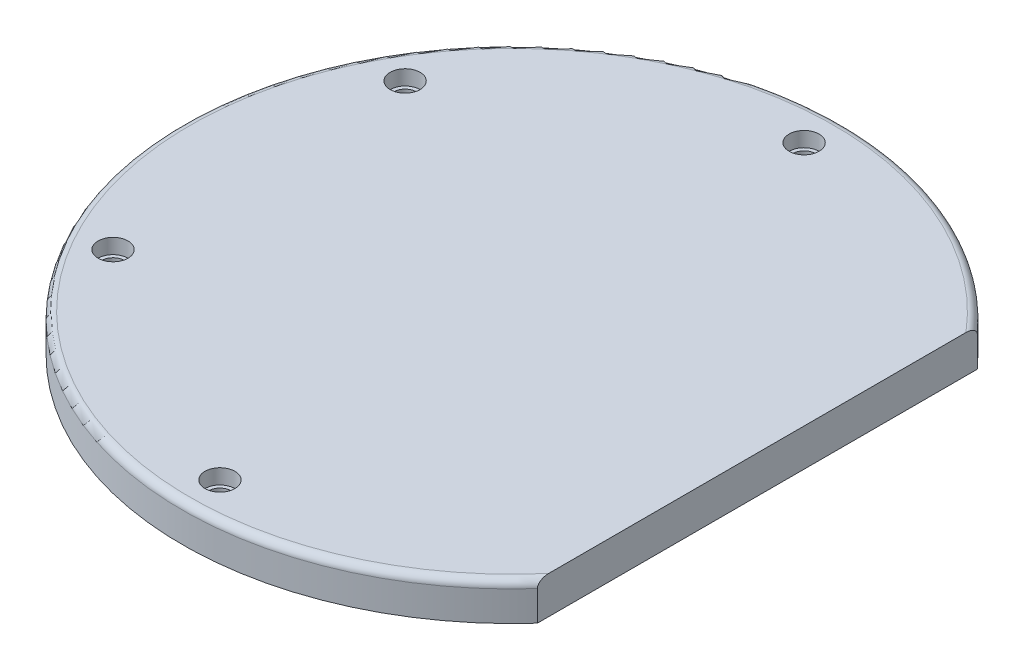
ISO-10303-21;
HEADER;
FILE_DESCRIPTION(('STEP AP214'),'2;1');
FILE_NAME('part.step','',(''),(''),'','','');
FILE_SCHEMA(('AUTOMOTIVE_DESIGN { 1 0 10303 214 1 1 1 1 }'));
ENDSEC;
DATA;
#1=APPLICATION_CONTEXT('core data for automotive mechanical design processes');
#2=APPLICATION_PROTOCOL_DEFINITION('international standard','automotive_design',2000,#1);
#3=PRODUCT_CONTEXT('',#1,'mechanical');
#4=PRODUCT('Part','Part','',(#3));
#5=PRODUCT_RELATED_PRODUCT_CATEGORY('part','',(#4));
#6=PRODUCT_DEFINITION_FORMATION('','',#4);
#7=PRODUCT_DEFINITION_CONTEXT('part definition',#1,'design');
#8=PRODUCT_DEFINITION('design','',#6,#7);
#9=PRODUCT_DEFINITION_SHAPE('','',#8);
#10=(LENGTH_UNIT() NAMED_UNIT(*) SI_UNIT(.MILLI.,.METRE.));
#11=(NAMED_UNIT(*) PLANE_ANGLE_UNIT() SI_UNIT($,.RADIAN.));
#12=(NAMED_UNIT(*) SI_UNIT($,.STERADIAN.) SOLID_ANGLE_UNIT());
#13=UNCERTAINTY_MEASURE_WITH_UNIT(LENGTH_MEASURE(1.E-05),#10,'distance_accuracy_value','');
#14=(GEOMETRIC_REPRESENTATION_CONTEXT(3) GLOBAL_UNCERTAINTY_ASSIGNED_CONTEXT((#13)) GLOBAL_UNIT_ASSIGNED_CONTEXT((#10,
#11,#12)) REPRESENTATION_CONTEXT('',''));
#15=CARTESIAN_POINT('',(0.,0.,0.));
#16=DIRECTION('',(0.,0.,1.));
#17=DIRECTION('',(1.,0.,0.));
#18=AXIS2_PLACEMENT_3D('',#15,#16,#17);
#19=CARTESIAN_POINT('',(0.,5.,-43.));
#20=DIRECTION('',(0.,1.,0.));
#21=DIRECTION('',(0.,0.,1.));
#22=AXIS2_PLACEMENT_3D('',#19,#20,#21);
#23=PLANE('',#22);
#24=DIRECTION('',(0.,0.,-1.));
#25=VECTOR('',#24,1.);
#26=CARTESIAN_POINT('',(32.7594965079774,4.99999999999999,29.3737193515533));
#27=LINE('',#26,#25);
#28=CARTESIAN_POINT('',(32.7594965079774,4.99999999999999,27.8534627747399));
#29=VERTEX_POINT('',#28);
#30=CARTESIAN_POINT('',(32.7594965079774,4.99999999999999,-27.8534627747399));
#31=VERTEX_POINT('',#30);
#32=EDGE_CURVE('E70',#29,#31,#27,.T.);
#33=ORIENTED_EDGE('',*,*,#32,.T.);
#34=CARTESIAN_POINT('',(0.,4.99999999999999,0.));
#35=DIRECTION('',(0.,-1.,0.));
#36=DIRECTION('',(0.,0.,-1.));
#37=AXIS2_PLACEMENT_3D('',#34,#35,#36);
#38=CIRCLE('',#37,43.);
#39=EDGE_CURVE('E11',#29,#31,#38,.T.);
#40=ORIENTED_EDGE('',*,*,#39,.F.);
#41=EDGE_LOOP('',(#33,#40));
#42=FACE_BOUND('',#41,.T.);
#43=CARTESIAN_POINT('',(0.,4.99999999999999,-39.));
#44=DIRECTION('',(0.,-1.,0.));
#45=DIRECTION('',(0.,0.,1.));
#46=AXIS2_PLACEMENT_3D('',#43,#44,#45);
#47=CIRCLE('',#46,2.);
#48=CARTESIAN_POINT('',(0.,4.99999999999999,-37.));
#49=VERTEX_POINT('',#48);
#50=EDGE_CURVE('E128',#49,#49,#47,.T.);
#51=ORIENTED_EDGE('',*,*,#50,.T.);
#52=EDGE_LOOP('',(#51));
#53=FACE_BOUND('',#52,.T.);
#54=CARTESIAN_POINT('',(-33.774990747593,4.99999999999999,-19.5000000000002));
#55=DIRECTION('',(0.,-1.,0.));
#56=DIRECTION('',(0.866025403784436,0.,0.500000000000004));
#57=AXIS2_PLACEMENT_3D('',#54,#55,#56);
#58=CIRCLE('',#57,2.);
#59=CARTESIAN_POINT('',(-32.0429399400241,4.99999999999999,-18.5000000000002));
#60=VERTEX_POINT('',#59);
#61=EDGE_CURVE('E116',#60,#60,#58,.T.);
#62=ORIENTED_EDGE('',*,*,#61,.T.);
#63=EDGE_LOOP('',(#62));
#64=FACE_BOUND('',#63,.T.);
#65=CARTESIAN_POINT('',(-33.7749907475932,4.99999999999999,19.4999999999999));
#66=DIRECTION('',(0.,-1.,0.));
#67=DIRECTION('',(0.86602540378444,0.,-0.499999999999998));
#68=AXIS2_PLACEMENT_3D('',#65,#66,#67);
#69=CIRCLE('',#68,2.);
#70=CARTESIAN_POINT('',(-32.0429399400243,4.99999999999999,18.4999999999999));
#71=VERTEX_POINT('',#70);
#72=EDGE_CURVE('E104',#71,#71,#69,.T.);
#73=ORIENTED_EDGE('',*,*,#72,.T.);
#74=EDGE_LOOP('',(#73));
#75=FACE_BOUND('',#74,.T.);
#76=CARTESIAN_POINT('',(0.,4.99999999999999,39.));
#77=DIRECTION('',(0.,-1.,0.));
#78=DIRECTION('',(0.,0.,-1.));
#79=AXIS2_PLACEMENT_3D('',#76,#77,#78);
#80=CIRCLE('',#79,2.);
#81=CARTESIAN_POINT('',(0.,4.99999999999999,37.));
#82=VERTEX_POINT('',#81);
#83=EDGE_CURVE('E92',#82,#82,#80,.T.);
#84=ORIENTED_EDGE('',*,*,#83,.T.);
#85=EDGE_LOOP('',(#84));
#86=FACE_BOUND('',#85,.T.);
#87=ADVANCED_FACE('F35',(#42,#53,#64,#75,#86),#23,.T.);
#88=CARTESIAN_POINT('',(0.,3.99999999999999,0.));
#89=DIRECTION('',(0.,-1.,0.));
#90=DIRECTION('',(0.,0.,-1.));
#91=AXIS2_PLACEMENT_3D('',#88,#89,#90);
#92=TOROIDAL_SURFACE('',#91,43.,0.999999999999997);
#93=CARTESIAN_POINT('',(32.7594965079774,4.6313888374302,-29.0363022265794));
#94=CARTESIAN_POINT('',(32.7594965079774,4.6849896076492,-28.9705130125571));
#95=CARTESIAN_POINT('',(32.7594965079774,4.73176070822807,-28.8990926526652));
#96=CARTESIAN_POINT('',(32.7594965079774,4.81305708813762,-28.7494832159368));
#97=CARTESIAN_POINT('',(32.7594965079774,4.84752609857503,-28.6712650219029));
#98=CARTESIAN_POINT('',(32.7594965079774,4.91638810052771,-28.4806002767737));
#99=CARTESIAN_POINT('',(32.7594965079774,4.94584629886412,-28.3663734419216));
#100=CARTESIAN_POINT('',(32.7594965079774,4.98627896672333,-28.1348334117051));
#101=CARTESIAN_POINT('',(32.7594965079774,4.99724448052,-28.0175187488665));
#102=CARTESIAN_POINT('',(32.7594965079774,5.00190780802818,-27.7793101291247));
#103=CARTESIAN_POINT('',(32.7594965079774,4.99511892459279,-27.6584070349373));
#104=CARTESIAN_POINT('',(32.7594965079774,4.96315616001637,-27.4190510894686));
#105=CARTESIAN_POINT('',(32.7594965079774,4.93799828381567,-27.3005961973968));
#106=CARTESIAN_POINT('',(32.7594965079774,4.87785773606334,-27.1027999593651));
#107=CARTESIAN_POINT('',(32.7594965079774,4.84774975808019,-27.0219695491961));
#108=CARTESIAN_POINT('',(32.7594965079774,4.77626464519732,-26.8654076462429));
#109=CARTESIAN_POINT('',(32.7594965079774,4.73490539001137,-26.7896682992593));
#110=CARTESIAN_POINT('',(32.7594965079774,4.65455910704241,-26.6694469888777));
#111=CARTESIAN_POINT('',(32.7594965079774,4.61899792140828,-26.6226826868658));
#112=CARTESIAN_POINT('',(32.7594965079774,4.5413336338999,-26.5348918320368));
#113=CARTESIAN_POINT('',(32.7594965079774,4.49924057388193,-26.4938566524368));
#114=CARTESIAN_POINT('',(32.7594965079774,4.42006295013742,-26.4296919548968));
#115=CARTESIAN_POINT('',(32.7594965079774,4.38451368202177,-26.4046793263071));
#116=CARTESIAN_POINT('',(32.7594965079774,4.30987010465061,-26.360633250885));
#117=CARTESIAN_POINT('',(32.7594965079774,4.27078083286302,-26.341591474548));
#118=CARTESIAN_POINT('',(32.7594965079774,4.19610836600184,-26.3133837660644));
#119=CARTESIAN_POINT('',(32.7594965079774,4.16093622361813,-26.3031375799893));
#120=CARTESIAN_POINT('',(32.7594965079774,4.08936409727011,-26.2887201221363));
#121=CARTESIAN_POINT('',(32.7594965079774,4.05296489682303,-26.2845450462094));
#122=CARTESIAN_POINT('',(32.7594965079774,3.97993060975387,-26.2826215690816));
#123=CARTESIAN_POINT('',(32.7594965079774,3.94329522130686,-26.2848844568812));
#124=CARTESIAN_POINT('',(32.7594965079774,3.87095836374223,-26.2956617537413));
#125=CARTESIAN_POINT('',(32.7594965079774,3.83525728886723,-26.3041787591042));
#126=CARTESIAN_POINT('',(32.7594965079774,3.76622352187433,-26.3266206659652));
#127=CARTESIAN_POINT('',(32.7594965079774,3.73286326406847,-26.3404622148659));
#128=CARTESIAN_POINT('',(32.7594965079774,3.66844504372243,-26.3726988885131));
#129=CARTESIAN_POINT('',(32.7594965079774,3.63738804147026,-26.3910958988358));
#130=CARTESIAN_POINT('',(32.7594965079774,3.5606172800777,-26.4432788789068));
#131=CARTESIAN_POINT('',(32.7594965079774,3.51677611778752,-26.4798221989167));
#132=CARTESIAN_POINT('',(32.7594965079774,3.43538864562285,-26.5593621573009));
#133=CARTESIAN_POINT('',(32.7594965079774,3.39786021809364,-26.6023764953749));
#134=CARTESIAN_POINT('',(32.7594965079774,3.31068663548235,-26.7164381873663));
#135=CARTESIAN_POINT('',(32.7594965079774,3.26490248876011,-26.7904229265322));
#136=CARTESIAN_POINT('',(32.7594965079774,3.18521469961976,-26.9444822688726));
#137=CARTESIAN_POINT('',(32.7594965079774,3.15133261612122,-27.0245676065024));
#138=CARTESIAN_POINT('',(32.7594965079774,3.10221301803098,-27.1653876662719));
#139=CARTESIAN_POINT('',(32.7594965079774,3.08441152591545,-27.2252509974073));
#140=CARTESIAN_POINT('',(32.7594965079774,3.05399012034533,-27.3462924203252));
#141=CARTESIAN_POINT('',(32.7594965079774,3.04137240790193,-27.4074710590041));
#142=CARTESIAN_POINT('',(32.7594965079774,3.01095319924132,-27.5923510054198));
#143=CARTESIAN_POINT('',(32.7594965079774,3.00060650386616,-27.7173340349822));
#144=CARTESIAN_POINT('',(32.7594965079774,2.99943395619872,-27.9698086222879));
#145=CARTESIAN_POINT('',(32.7594965079774,3.00898227799037,-28.097302774562));
#146=CARTESIAN_POINT('',(32.7594965079774,3.03943929881587,-28.2857472159119));
#147=CARTESIAN_POINT('',(32.7594965079774,3.05226863675851,-28.3480606161311));
#148=CARTESIAN_POINT('',(32.7594965079774,3.08363624759289,-28.4712166996997));
#149=CARTESIAN_POINT('',(32.7594965079774,3.10217085555131,-28.5320603002323));
#150=CARTESIAN_POINT('',(32.7594965079774,3.1493915763254,-28.6626418144641));
#151=CARTESIAN_POINT('',(32.7594965079774,3.17932244222692,-28.7319383585441));
#152=CARTESIAN_POINT('',(32.7594965079774,3.24874541453021,-28.8655905541524));
#153=CARTESIAN_POINT('',(32.7594965079774,3.28822484719954,-28.9299526072835));
#154=CARTESIAN_POINT('',(32.7594965079774,3.36667142107688,-29.0359227221232));
#155=CARTESIAN_POINT('',(32.7594965079774,3.40334440864876,-29.0792185816049));
#156=CARTESIAN_POINT('',(32.7594965079774,3.48300821169931,-29.1595855745505));
#157=CARTESIAN_POINT('',(32.7594965079774,3.525989136353,-29.1966662618715));
#158=CARTESIAN_POINT('',(32.7594965079774,3.60729416339461,-29.2544899006595));
#159=CARTESIAN_POINT('',(32.7594965079774,3.64433739403702,-29.2770243262778));
#160=CARTESIAN_POINT('',(32.7594965079774,3.72161955488685,-29.3157692039061));
#161=CARTESIAN_POINT('',(32.7594965079774,3.76185614046837,-29.3319842449691));
#162=CARTESIAN_POINT('',(32.7594965079774,3.84496610799989,-29.356976861111));
#163=CARTESIAN_POINT('',(32.7594965079774,3.88785784566764,-29.3656945290222));
#164=CARTESIAN_POINT('',(32.7594965079774,3.97451616090718,-29.3746424448729));
#165=CARTESIAN_POINT('',(32.7594965079774,4.01828219087028,-29.3748778485739));
#166=CARTESIAN_POINT('',(32.7594965079774,4.09968410518541,-29.3673549618068));
#167=CARTESIAN_POINT('',(32.7594965079774,4.13741492057936,-29.3605710644983));
#168=CARTESIAN_POINT('',(32.7594965079774,4.21126909907077,-29.3409763474874));
#169=CARTESIAN_POINT('',(32.7594965079774,4.24739200719694,-29.3281638336537));
#170=CARTESIAN_POINT('',(32.7594965079774,4.31858996966368,-29.2967410359871));
#171=CARTESIAN_POINT('',(32.7594965079774,4.35357721541824,-29.2779343156663));
#172=CARTESIAN_POINT('',(32.7594965079774,4.42060519806866,-29.2356918540243));
#173=CARTESIAN_POINT('',(32.7594965079774,4.45264545673044,-29.2122553633242));
#174=CARTESIAN_POINT('',(32.7594965079774,4.51029720532081,-29.1644342000467));
#175=CARTESIAN_POINT('',(32.7594965079774,4.53622881836472,-29.1404306967861));
#176=CARTESIAN_POINT('',(32.7594965079774,4.58562992972216,-29.0900431610813));
#177=CARTESIAN_POINT('',(32.7594965079774,4.60909986693033,-29.0636595545536));
#178=CARTESIAN_POINT('',(32.7594965079774,4.6313888374302,-29.0363022265794));
#179=B_SPLINE_CURVE_WITH_KNOTS('',3,(#93,#94,#95,#96,#97,#98,#99,#100,#101,#102,#103,#104,#105,
#106,#107,#108,#109,#110,#111,#112,#113,#114,#115,#116,#117,#118,#119,#120,#121,#122,#123,#124,
#125,#126,#127,#128,#129,#130,#131,#132,#133,#134,#135,#136,#137,#138,#139,#140,#141,#142,#143,
#144,#145,#146,#147,#148,#149,#150,#151,#152,#153,#154,#155,#156,#157,#158,#159,#160,#161,#162,
#163,#164,#165,#166,#167,#168,#169,#170,#171,#172,#173,#174,#175,#176,#177,#178),.UNSPECIFIED.,
.T.,.F.,(4,2,2,2,2,2,2,2,2,2,2,2,2,2,2,2,2,2,2,2,2,2,2,2,2,2,2,2,2,2,2,2,2,2,2,2,2,2,2,2,2,2,4),
(0.,0.254439468887953,0.510028245565042,0.86204346860273,1.21422911836155,1.57616968261061,
1.93779526307425,2.19589159397905,2.45358014893546,2.6293474662799,2.80484719485844,
2.93480012457682,3.06457095140594,3.17399745984454,3.28335537219776,3.39290516230589,
3.50250045608305,3.61044567050968,3.7184356400412,3.88868362723923,4.0594060450985,
4.31899299129992,4.57904774723548,4.76617642335914,4.9533844716253,5.32799530945479,
5.70971515455927,5.90035437727524,6.09087139243464,6.31669615629702,6.54222281405568,
6.71190101207328,6.88131594282432,7.01090089437009,7.14039156691772,7.270907558638,
7.40134421768572,7.51582378312883,7.63033553827141,7.74907146558071,7.86782662736516,
7.97364986127588,8.07945419567022),.UNSPECIFIED.);
#180=CARTESIAN_POINT('',(32.7594965079774,3.99999999999999,-29.3737193515533));
#181=VERTEX_POINT('',#180);
#182=EDGE_CURVE('E131',#181,#31,#179,.T.);
#183=ORIENTED_EDGE('',*,*,#182,.F.);
#184=CARTESIAN_POINT('',(0.,3.99999999999999,0.));
#185=DIRECTION('',(0.,-1.,0.));
#186=DIRECTION('',(0.,0.,-1.));
#187=AXIS2_PLACEMENT_3D('',#184,#185,#186);
#188=CIRCLE('',#187,44.);
#189=CARTESIAN_POINT('',(32.7594965079774,3.99999999999999,29.3737193515533));
#190=VERTEX_POINT('',#189);
#191=EDGE_CURVE('E42',#190,#181,#188,.T.);
#192=ORIENTED_EDGE('',*,*,#191,.F.);
#193=CARTESIAN_POINT('',(32.7594965079774,4.34017921379498,26.3785642712574));
#194=CARTESIAN_POINT('',(32.7594965079774,4.39285964623673,26.4089565131447));
#195=CARTESIAN_POINT('',(32.7594965079774,4.44216725528471,26.4453762599617));
#196=CARTESIAN_POINT('',(32.7594965079774,4.5335492116342,26.5265412590283));
#197=CARTESIAN_POINT('',(32.7594965079774,4.5755756810551,26.5713378681437));
#198=CARTESIAN_POINT('',(32.7594965079774,4.66703662323063,26.6842022781957));
#199=CARTESIAN_POINT('',(32.7594965079774,4.71341380212071,26.7547289746656));
#200=CARTESIAN_POINT('',(32.7594965079774,4.79466712853883,26.9019427977946));
#201=CARTESIAN_POINT('',(32.7594965079774,4.82953832668937,26.9786325579452));
#202=CARTESIAN_POINT('',(32.7594965079774,4.88096853723809,27.1143493414208));
#203=CARTESIAN_POINT('',(32.7594965079774,4.89992805674273,27.1724892815336));
#204=CARTESIAN_POINT('',(32.7594965079774,4.93279932221638,27.2901892527177));
#205=CARTESIAN_POINT('',(32.7594965079774,4.94670885571875,27.3497498940684));
#206=CARTESIAN_POINT('',(32.7594965079774,4.98124010803987,27.5299597132093));
#207=CARTESIAN_POINT('',(32.7594965079774,4.99463530472783,27.6520565325394));
#208=CARTESIAN_POINT('',(32.7594965079774,5.0028388084028,27.8995891152803));
#209=CARTESIAN_POINT('',(32.7594965079774,4.99721434989421,28.0250372998451));
#210=CARTESIAN_POINT('',(32.7594965079774,4.9655232204872,28.2733034314333));
#211=CARTESIAN_POINT('',(32.7594965079774,4.93949689149358,28.396126078278));
#212=CARTESIAN_POINT('',(32.7594965079774,4.87796433228183,28.5919427295069));
#213=CARTESIAN_POINT('',(32.7594965079774,4.84916793950768,28.6670604809494));
#214=CARTESIAN_POINT('',(32.7594965079774,4.78103646476069,28.8124062877787));
#215=CARTESIAN_POINT('',(32.7594965079774,4.7417162382901,28.8826410612912));
#216=CARTESIAN_POINT('',(32.7594965079774,4.66346981402059,28.9973420763209));
#217=CARTESIAN_POINT('',(32.7594965079774,4.62727399061099,29.0436629279066));
#218=CARTESIAN_POINT('',(32.7594965079774,4.54816327199463,29.130200600696));
#219=CARTESIAN_POINT('',(32.7594965079774,4.50525904109113,29.1704269138472));
#220=CARTESIAN_POINT('',(32.7594965079774,4.42390096761993,29.2335869437067));
#221=CARTESIAN_POINT('',(32.7594965079774,4.38687545453956,29.2583506246831));
#222=CARTESIAN_POINT('',(32.7594965079774,4.30928116831318,29.3015762768201));
#223=CARTESIAN_POINT('',(32.7594965079774,4.26871480312654,29.3200424892863));
#224=CARTESIAN_POINT('',(32.7594965079774,4.18447601381091,29.3494417727962));
#225=CARTESIAN_POINT('',(32.7594965079774,4.1407788442283,29.3603052953944));
#226=CARTESIAN_POINT('',(32.7594965079774,4.05210035448386,29.3731682339395));
#227=CARTESIAN_POINT('',(32.7594965079774,4.00712015515899,29.3751751617964));
#228=CARTESIAN_POINT('',(32.7594965079774,3.92390994262679,29.3704954303064));
#229=CARTESIAN_POINT('',(32.7594965079774,3.88560862073878,29.3649754326483));
#230=CARTESIAN_POINT('',(32.7594965079774,3.81046176409471,29.3476631752588));
#231=CARTESIAN_POINT('',(32.7594965079774,3.77361646829848,29.3358698905243));
#232=CARTESIAN_POINT('',(32.7594965079774,3.70165340751043,29.3065674643284));
#233=CARTESIAN_POINT('',(32.7594965079774,3.66657020265401,29.2889745641051));
#234=CARTESIAN_POINT('',(32.7594965079774,3.59921610873861,29.2490813076422));
#235=CARTESIAN_POINT('',(32.7594965079774,3.56694651893614,29.2267787927175));
#236=CARTESIAN_POINT('',(32.7594965079774,3.48783917084584,29.1645371071685));
#237=CARTESIAN_POINT('',(32.7594965079774,3.44320008886281,29.121797496514));
#238=CARTESIAN_POINT('',(32.7594965079774,3.36125559546353,29.029774713287));
#239=CARTESIAN_POINT('',(32.7594965079774,3.3239700933711,28.980474365587));
#240=CARTESIAN_POINT('',(32.7594965079774,3.24043912538536,28.8532888980122));
#241=CARTESIAN_POINT('',(32.7594965079774,3.19814971706419,28.7728124987937));
#242=CARTESIAN_POINT('',(32.7594965079774,3.12661641387642,28.6063467869646));
#243=CARTESIAN_POINT('',(32.7594965079774,3.09739275006027,28.5203491590759));
#244=CARTESIAN_POINT('',(32.7594965079774,3.04154102660846,28.3113541676828));
#245=CARTESIAN_POINT('',(32.7594965079774,3.02029104263975,28.1869139084435));
#246=CARTESIAN_POINT('',(32.7594965079774,2.9980391717412,27.9361791200877));
#247=CARTESIAN_POINT('',(32.7594965079774,2.99707636448918,27.8098814810516));
#248=CARTESIAN_POINT('',(32.7594965079774,3.01508336521653,27.5564779064484));
#249=CARTESIAN_POINT('',(32.7594965079774,3.03438193350548,27.429392952947));
#250=CARTESIAN_POINT('',(32.7594965079774,3.07947232006744,27.24291792034));
#251=CARTESIAN_POINT('',(32.7594965079774,3.09717155578093,27.1815007813693));
#252=CARTESIAN_POINT('',(32.7594965079774,3.13829801058383,27.0606328803466));
#253=CARTESIAN_POINT('',(32.7594965079774,3.16172069566698,27.0011806038843));
#254=CARTESIAN_POINT('',(32.7594965079774,3.21658618248765,26.8811163954805));
#255=CARTESIAN_POINT('',(32.7594965079774,3.24846719188748,26.8207021615589));
#256=CARTESIAN_POINT('',(32.7594965079774,3.32009157115748,26.7046890242788));
#257=CARTESIAN_POINT('',(32.7594965079774,3.35982645359889,26.6490850151137));
#258=CARTESIAN_POINT('',(32.7594965079774,3.43798637106333,26.5570298586521));
#259=CARTESIAN_POINT('',(32.7594965079774,3.47465449535779,26.5190986941001));
#260=CARTESIAN_POINT('',(32.7594965079774,3.55348051150861,26.4494041092489));
#261=CARTESIAN_POINT('',(32.7594965079774,3.59562913870851,26.417630500544));
#262=CARTESIAN_POINT('',(32.7594965079774,3.6740851680475,26.3694372712267));
#263=CARTESIAN_POINT('',(32.7594965079774,3.70924696959293,26.3511641176739));
#264=CARTESIAN_POINT('',(32.7594965079774,3.78209170789609,26.3205973744449));
#265=CARTESIAN_POINT('',(32.7594965079774,3.81977214917744,26.308297963013));
#266=CARTESIAN_POINT('',(32.7594965079774,3.89703507381867,26.2906310698762));
#267=CARTESIAN_POINT('',(32.7594965079774,3.93662901856898,26.2853126804374));
#268=CARTESIAN_POINT('',(32.7594965079774,4.01612043646567,26.2823136445629));
#269=CARTESIAN_POINT('',(32.7594965079774,4.05601793196552,26.2846335661516));
#270=CARTESIAN_POINT('',(32.7594965079774,4.13049388289415,26.2960204488636));
#271=CARTESIAN_POINT('',(32.7594965079774,4.16518980817103,26.3043506651449));
#272=CARTESIAN_POINT('',(32.7594965079774,4.23282237925952,26.326284344509));
#273=CARTESIAN_POINT('',(32.7594965079774,4.26576091810794,26.3398819975333));
#274=CARTESIAN_POINT('',(32.7594965079774,4.31199935923344,26.3628676421779));
#275=CARTESIAN_POINT('',(32.7594965079774,4.32620790144164,26.3705039823638));
#276=CARTESIAN_POINT('',(32.7594965079774,4.34017921379498,26.3785642712574));
#277=B_SPLINE_CURVE_WITH_KNOTS('',3,(#193,#194,#195,#196,#197,#198,#199,#200,#201,#202,#203,
#204,#205,#206,#207,#208,#209,#210,#211,#212,#213,#214,#215,#216,#217,#218,#219,#220,#221,#222,
#223,#224,#225,#226,#227,#228,#229,#230,#231,#232,#233,#234,#235,#236,#237,#238,#239,#240,#241,
#242,#243,#244,#245,#246,#247,#248,#249,#250,#251,#252,#253,#254,#255,#256,#257,#258,#259,#260,
#261,#262,#263,#264,#265,#266,#267,#268,#269,#270,#271,#272,#273,#274,#275,#276),.UNSPECIFIED.,
.T.,.F.,(4,2,2,2,2,2,2,2,2,2,2,2,2,2,2,2,2,2,2,2,2,2,2,2,2,2,2,2,2,2,2,2,2,2,2,2,2,2,2,2,2,4),
(0.,0.182407415244111,0.365972153513843,0.617802045105924,0.869740122278591,1.05296785417637,
1.23627576400863,1.60314472161052,1.97841691097524,2.35294891706962,2.59365981104035,
2.83403269209188,3.00984820131458,3.1853870075451,3.31852427207617,3.45157169158968,
3.58582084095103,3.71995610211613,3.83549554270974,3.95105386729403,4.06836010484509,
4.18572022770135,4.37007133527962,4.55491490854432,4.82614330942918,5.09779023917238,
5.47452981324556,5.85199504364014,6.23568107727008,6.42720719488161,6.61858207829087,
6.82301587840134,7.027229949585,7.18500514324103,7.34251700748154,7.46094591106001,
7.57925916610568,7.6984000491359,7.81754979230068,7.92414387777472,8.03062072169589,
8.07899676676268),.UNSPECIFIED.);
#278=EDGE_CURVE('E77',#29,#190,#277,.T.);
#279=ORIENTED_EDGE('',*,*,#278,.F.);
#280=ORIENTED_EDGE('',*,*,#39,.T.);
#281=EDGE_LOOP('',(#183,#192,#279,#280));
#282=FACE_BOUND('',#281,.T.);
#283=ADVANCED_FACE('F139',(#282),#92,.T.);
#284=CARTESIAN_POINT('',(0.,0.,0.));
#285=DIRECTION('',(0.,-1.,0.));
#286=DIRECTION('',(0.,0.,-1.));
#287=AXIS2_PLACEMENT_3D('',#284,#285,#286);
#288=CYLINDRICAL_SURFACE('',#287,44.);
#289=DIRECTION('',(0.,-1.,0.));
#290=VECTOR('',#289,1.);
#291=CARTESIAN_POINT('',(32.7594965079774,4.99999999999999,-29.3737193515533));
#292=LINE('',#291,#290);
#293=CARTESIAN_POINT('',(32.7594965079774,0.,-29.3737193515533));
#294=VERTEX_POINT('',#293);
#295=EDGE_CURVE('E55',#181,#294,#292,.T.);
#296=ORIENTED_EDGE('',*,*,#295,.T.);
#297=CARTESIAN_POINT('',(0.,0.,0.));
#298=DIRECTION('',(0.,-1.,0.));
#299=DIRECTION('',(0.,0.,-1.));
#300=AXIS2_PLACEMENT_3D('',#297,#298,#299);
#301=CIRCLE('',#300,44.);
#302=CARTESIAN_POINT('',(32.7594965079774,0.,29.3737193515533));
#303=VERTEX_POINT('',#302);
#304=EDGE_CURVE('E75',#303,#294,#301,.T.);
#305=ORIENTED_EDGE('',*,*,#304,.F.);
#306=DIRECTION('',(0.,-1.,0.));
#307=VECTOR('',#306,1.);
#308=CARTESIAN_POINT('',(32.7594965079774,4.99999999999999,29.3737193515533));
#309=LINE('',#308,#307);
#310=EDGE_CURVE('E49',#190,#303,#309,.T.);
#311=ORIENTED_EDGE('',*,*,#310,.F.);
#312=ORIENTED_EDGE('',*,*,#191,.T.);
#313=EDGE_LOOP('',(#296,#305,#311,#312));
#314=FACE_BOUND('',#313,.T.);
#315=ADVANCED_FACE('F74',(#314),#288,.T.);
#316=CARTESIAN_POINT('',(0.,0.,0.));
#317=DIRECTION('',(0.,-1.,0.));
#318=DIRECTION('',(0.,0.,-1.));
#319=AXIS2_PLACEMENT_3D('',#316,#317,#318);
#320=PLANE('',#319);
#321=DIRECTION('',(0.,0.,-1.));
#322=VECTOR('',#321,1.);
#323=CARTESIAN_POINT('',(32.7594965079774,0.,29.3737193515533));
#324=LINE('',#323,#322);
#325=EDGE_CURVE('E65',#303,#294,#324,.T.);
#326=ORIENTED_EDGE('',*,*,#325,.F.);
#327=ORIENTED_EDGE('',*,*,#304,.T.);
#328=EDGE_LOOP('',(#326,#327));
#329=FACE_BOUND('',#328,.T.);
#330=CARTESIAN_POINT('',(0.,0.,-39.));
#331=DIRECTION('',(0.,-1.,0.));
#332=DIRECTION('',(0.,0.,1.));
#333=AXIS2_PLACEMENT_3D('',#330,#331,#332);
#334=CIRCLE('',#333,1.5);
#335=CARTESIAN_POINT('',(0.,0.,-37.5));
#336=VERTEX_POINT('',#335);
#337=EDGE_CURVE('E119',#336,#336,#334,.T.);
#338=ORIENTED_EDGE('',*,*,#337,.F.);
#339=EDGE_LOOP('',(#338));
#340=FACE_BOUND('',#339,.T.);
#341=CARTESIAN_POINT('',(-33.774990747593,0.,-19.5000000000002));
#342=DIRECTION('',(0.,-1.,0.));
#343=DIRECTION('',(0.866025403784436,0.,0.500000000000004));
#344=AXIS2_PLACEMENT_3D('',#341,#342,#343);
#345=CIRCLE('',#344,1.5);
#346=CARTESIAN_POINT('',(-32.4759526419164,0.,-18.7500000000002));
#347=VERTEX_POINT('',#346);
#348=EDGE_CURVE('E107',#347,#347,#345,.T.);
#349=ORIENTED_EDGE('',*,*,#348,.F.);
#350=EDGE_LOOP('',(#349));
#351=FACE_BOUND('',#350,.T.);
#352=CARTESIAN_POINT('',(-33.7749907475932,0.,19.4999999999999));
#353=DIRECTION('',(0.,-1.,0.));
#354=DIRECTION('',(0.86602540378444,0.,-0.499999999999998));
#355=AXIS2_PLACEMENT_3D('',#352,#353,#354);
#356=CIRCLE('',#355,1.5);
#357=CARTESIAN_POINT('',(-32.4759526419165,0.,18.7499999999999));
#358=VERTEX_POINT('',#357);
#359=EDGE_CURVE('E95',#358,#358,#356,.T.);
#360=ORIENTED_EDGE('',*,*,#359,.F.);
#361=EDGE_LOOP('',(#360));
#362=FACE_BOUND('',#361,.T.);
#363=CARTESIAN_POINT('',(0.,0.,39.));
#364=DIRECTION('',(0.,-1.,0.));
#365=DIRECTION('',(0.,0.,-1.));
#366=AXIS2_PLACEMENT_3D('',#363,#364,#365);
#367=CIRCLE('',#366,1.5);
#368=CARTESIAN_POINT('',(0.,0.,37.5));
#369=VERTEX_POINT('',#368);
#370=EDGE_CURVE('E81',#369,#369,#367,.T.);
#371=ORIENTED_EDGE('',*,*,#370,.F.);
#372=EDGE_LOOP('',(#371));
#373=FACE_BOUND('',#372,.T.);
#374=ADVANCED_FACE('F79',(#329,#340,#351,#362,#373),#320,.T.);
#375=CARTESIAN_POINT('',(0.,0.,39.));
#376=DIRECTION('',(0.,-1.,0.));
#377=DIRECTION('',(0.,0.,-1.));
#378=AXIS2_PLACEMENT_3D('',#375,#376,#377);
#379=CYLINDRICAL_SURFACE('',#378,1.5);
#380=CARTESIAN_POINT('',(0.,2.99999999999999,39.));
#381=DIRECTION('',(0.,-1.,0.));
#382=DIRECTION('',(0.,0.,-1.));
#383=AXIS2_PLACEMENT_3D('',#380,#381,#382);
#384=CIRCLE('',#383,1.5);
#385=CARTESIAN_POINT('',(0.,2.99999999999999,37.5));
#386=VERTEX_POINT('',#385);
#387=EDGE_CURVE('E84',#386,#386,#384,.T.);
#388=ORIENTED_EDGE('',*,*,#387,.F.);
#389=EDGE_LOOP('',(#388));
#390=FACE_BOUND('',#389,.T.);
#391=ORIENTED_EDGE('',*,*,#370,.T.);
#392=EDGE_LOOP('',(#391));
#393=FACE_BOUND('',#392,.T.);
#394=ADVANCED_FACE('F189',(#390,#393),#379,.F.);
#395=CARTESIAN_POINT('',(0.,2.99999999999999,37.5));
#396=DIRECTION('',(0.,-1.,0.));
#397=DIRECTION('',(0.,0.,-1.));
#398=AXIS2_PLACEMENT_3D('',#395,#396,#397);
#399=PLANE('',#398);
#400=CARTESIAN_POINT('',(0.,2.99999999999999,39.));
#401=DIRECTION('',(0.,-1.,0.));
#402=DIRECTION('',(0.,0.,-1.));
#403=AXIS2_PLACEMENT_3D('',#400,#401,#402);
#404=CIRCLE('',#403,2.);
#405=CARTESIAN_POINT('',(0.,2.99999999999999,37.));
#406=VERTEX_POINT('',#405);
#407=EDGE_CURVE('E89',#406,#406,#404,.T.);
#408=ORIENTED_EDGE('',*,*,#407,.F.);
#409=EDGE_LOOP('',(#408));
#410=FACE_BOUND('',#409,.T.);
#411=ORIENTED_EDGE('',*,*,#387,.T.);
#412=EDGE_LOOP('',(#411));
#413=FACE_BOUND('',#412,.T.);
#414=ADVANCED_FACE('F185',(#410,#413),#399,.F.);
#415=CARTESIAN_POINT('',(0.,0.,39.));
#416=DIRECTION('',(0.,-1.,0.));
#417=DIRECTION('',(0.,0.,-1.));
#418=AXIS2_PLACEMENT_3D('',#415,#416,#417);
#419=CYLINDRICAL_SURFACE('',#418,2.);
#420=ORIENTED_EDGE('',*,*,#83,.F.);
#421=EDGE_LOOP('',(#420));
#422=FACE_BOUND('',#421,.T.);
#423=ORIENTED_EDGE('',*,*,#407,.T.);
#424=EDGE_LOOP('',(#423));
#425=FACE_BOUND('',#424,.T.);
#426=ADVANCED_FACE('F181',(#422,#425),#419,.F.);
#427=CARTESIAN_POINT('',(-33.7749907475932,0.,19.4999999999999));
#428=DIRECTION('',(0.,-1.,0.));
#429=DIRECTION('',(0.86602540378444,0.,-0.499999999999998));
#430=AXIS2_PLACEMENT_3D('',#427,#428,#429);
#431=CYLINDRICAL_SURFACE('',#430,1.5);
#432=CARTESIAN_POINT('',(-33.7749907475932,2.99999999999999,19.4999999999999));
#433=DIRECTION('',(0.,-1.,0.));
#434=DIRECTION('',(0.86602540378444,0.,-0.499999999999998));
#435=AXIS2_PLACEMENT_3D('',#432,#433,#434);
#436=CIRCLE('',#435,1.5);
#437=CARTESIAN_POINT('',(-32.4759526419165,2.99999999999999,18.7499999999999));
#438=VERTEX_POINT('',#437);
#439=EDGE_CURVE('E98',#438,#438,#436,.T.);
#440=ORIENTED_EDGE('',*,*,#439,.F.);
#441=EDGE_LOOP('',(#440));
#442=FACE_BOUND('',#441,.T.);
#443=ORIENTED_EDGE('',*,*,#359,.T.);
#444=EDGE_LOOP('',(#443));
#445=FACE_BOUND('',#444,.T.);
#446=ADVANCED_FACE('F177',(#442,#445),#431,.F.);
#447=CARTESIAN_POINT('',(-32.4759526419165,2.99999999999999,18.7499999999999));
#448=DIRECTION('',(0.,-1.,0.));
#449=DIRECTION('',(0.86602540378444,0.,-0.499999999999998));
#450=AXIS2_PLACEMENT_3D('',#447,#448,#449);
#451=PLANE('',#450);
#452=CARTESIAN_POINT('',(-33.7749907475932,2.99999999999999,19.4999999999999));
#453=DIRECTION('',(0.,-1.,0.));
#454=DIRECTION('',(0.86602540378444,0.,-0.499999999999998));
#455=AXIS2_PLACEMENT_3D('',#452,#453,#454);
#456=CIRCLE('',#455,2.);
#457=CARTESIAN_POINT('',(-32.0429399400243,2.99999999999999,18.4999999999999));
#458=VERTEX_POINT('',#457);
#459=EDGE_CURVE('E101',#458,#458,#456,.T.);
#460=ORIENTED_EDGE('',*,*,#459,.F.);
#461=EDGE_LOOP('',(#460));
#462=FACE_BOUND('',#461,.T.);
#463=ORIENTED_EDGE('',*,*,#439,.T.);
#464=EDGE_LOOP('',(#463));
#465=FACE_BOUND('',#464,.T.);
#466=ADVANCED_FACE('F173',(#462,#465),#451,.F.);
#467=CARTESIAN_POINT('',(-33.7749907475932,0.,19.4999999999999));
#468=DIRECTION('',(0.,-1.,0.));
#469=DIRECTION('',(0.86602540378444,0.,-0.499999999999998));
#470=AXIS2_PLACEMENT_3D('',#467,#468,#469);
#471=CYLINDRICAL_SURFACE('',#470,2.);
#472=ORIENTED_EDGE('',*,*,#72,.F.);
#473=EDGE_LOOP('',(#472));
#474=FACE_BOUND('',#473,.T.);
#475=ORIENTED_EDGE('',*,*,#459,.T.);
#476=EDGE_LOOP('',(#475));
#477=FACE_BOUND('',#476,.T.);
#478=ADVANCED_FACE('F169',(#474,#477),#471,.F.);
#479=CARTESIAN_POINT('',(-33.774990747593,0.,-19.5000000000002));
#480=DIRECTION('',(0.,-1.,0.));
#481=DIRECTION('',(0.866025403784436,0.,0.500000000000004));
#482=AXIS2_PLACEMENT_3D('',#479,#480,#481);
#483=CYLINDRICAL_SURFACE('',#482,1.5);
#484=CARTESIAN_POINT('',(-33.774990747593,2.99999999999999,-19.5000000000002));
#485=DIRECTION('',(0.,-1.,0.));
#486=DIRECTION('',(0.866025403784436,0.,0.500000000000004));
#487=AXIS2_PLACEMENT_3D('',#484,#485,#486);
#488=CIRCLE('',#487,1.5);
#489=CARTESIAN_POINT('',(-32.4759526419164,2.99999999999999,-18.7500000000002));
#490=VERTEX_POINT('',#489);
#491=EDGE_CURVE('E110',#490,#490,#488,.T.);
#492=ORIENTED_EDGE('',*,*,#491,.F.);
#493=EDGE_LOOP('',(#492));
#494=FACE_BOUND('',#493,.T.);
#495=ORIENTED_EDGE('',*,*,#348,.T.);
#496=EDGE_LOOP('',(#495));
#497=FACE_BOUND('',#496,.T.);
#498=ADVANCED_FACE('F165',(#494,#497),#483,.F.);
#499=CARTESIAN_POINT('',(-32.4759526419164,2.99999999999999,-18.7500000000002));
#500=DIRECTION('',(0.,-1.,0.));
#501=DIRECTION('',(0.866025403784436,0.,0.500000000000004));
#502=AXIS2_PLACEMENT_3D('',#499,#500,#501);
#503=PLANE('',#502);
#504=CARTESIAN_POINT('',(-33.774990747593,2.99999999999999,-19.5000000000002));
#505=DIRECTION('',(0.,-1.,0.));
#506=DIRECTION('',(0.866025403784436,0.,0.500000000000004));
#507=AXIS2_PLACEMENT_3D('',#504,#505,#506);
#508=CIRCLE('',#507,2.);
#509=CARTESIAN_POINT('',(-32.0429399400241,2.99999999999999,-18.5000000000002));
#510=VERTEX_POINT('',#509);
#511=EDGE_CURVE('E113',#510,#510,#508,.T.);
#512=ORIENTED_EDGE('',*,*,#511,.F.);
#513=EDGE_LOOP('',(#512));
#514=FACE_BOUND('',#513,.T.);
#515=ORIENTED_EDGE('',*,*,#491,.T.);
#516=EDGE_LOOP('',(#515));
#517=FACE_BOUND('',#516,.T.);
#518=ADVANCED_FACE('F161',(#514,#517),#503,.F.);
#519=CARTESIAN_POINT('',(-33.774990747593,0.,-19.5000000000002));
#520=DIRECTION('',(0.,-1.,0.));
#521=DIRECTION('',(0.866025403784436,0.,0.500000000000004));
#522=AXIS2_PLACEMENT_3D('',#519,#520,#521);
#523=CYLINDRICAL_SURFACE('',#522,2.);
#524=ORIENTED_EDGE('',*,*,#61,.F.);
#525=EDGE_LOOP('',(#524));
#526=FACE_BOUND('',#525,.T.);
#527=ORIENTED_EDGE('',*,*,#511,.T.);
#528=EDGE_LOOP('',(#527));
#529=FACE_BOUND('',#528,.T.);
#530=ADVANCED_FACE('F157',(#526,#529),#523,.F.);
#531=CARTESIAN_POINT('',(0.,0.,-39.));
#532=DIRECTION('',(0.,-1.,0.));
#533=DIRECTION('',(0.,0.,1.));
#534=AXIS2_PLACEMENT_3D('',#531,#532,#533);
#535=CYLINDRICAL_SURFACE('',#534,1.5);
#536=CARTESIAN_POINT('',(0.,2.99999999999999,-39.));
#537=DIRECTION('',(0.,-1.,0.));
#538=DIRECTION('',(0.,0.,1.));
#539=AXIS2_PLACEMENT_3D('',#536,#537,#538);
#540=CIRCLE('',#539,1.5);
#541=CARTESIAN_POINT('',(0.,2.99999999999999,-37.5));
#542=VERTEX_POINT('',#541);
#543=EDGE_CURVE('E122',#542,#542,#540,.T.);
#544=ORIENTED_EDGE('',*,*,#543,.F.);
#545=EDGE_LOOP('',(#544));
#546=FACE_BOUND('',#545,.T.);
#547=ORIENTED_EDGE('',*,*,#337,.T.);
#548=EDGE_LOOP('',(#547));
#549=FACE_BOUND('',#548,.T.);
#550=ADVANCED_FACE('F153',(#546,#549),#535,.F.);
#551=CARTESIAN_POINT('',(0.,2.99999999999999,-37.5));
#552=DIRECTION('',(0.,-1.,0.));
#553=DIRECTION('',(0.,0.,1.));
#554=AXIS2_PLACEMENT_3D('',#551,#552,#553);
#555=PLANE('',#554);
#556=CARTESIAN_POINT('',(0.,2.99999999999999,-39.));
#557=DIRECTION('',(0.,-1.,0.));
#558=DIRECTION('',(0.,0.,1.));
#559=AXIS2_PLACEMENT_3D('',#556,#557,#558);
#560=CIRCLE('',#559,2.);
#561=CARTESIAN_POINT('',(0.,2.99999999999999,-37.));
#562=VERTEX_POINT('',#561);
#563=EDGE_CURVE('E125',#562,#562,#560,.T.);
#564=ORIENTED_EDGE('',*,*,#563,.F.);
#565=EDGE_LOOP('',(#564));
#566=FACE_BOUND('',#565,.T.);
#567=ORIENTED_EDGE('',*,*,#543,.T.);
#568=EDGE_LOOP('',(#567));
#569=FACE_BOUND('',#568,.T.);
#570=ADVANCED_FACE('F149',(#566,#569),#555,.F.);
#571=CARTESIAN_POINT('',(0.,0.,-39.));
#572=DIRECTION('',(0.,-1.,0.));
#573=DIRECTION('',(0.,0.,1.));
#574=AXIS2_PLACEMENT_3D('',#571,#572,#573);
#575=CYLINDRICAL_SURFACE('',#574,2.);
#576=ORIENTED_EDGE('',*,*,#50,.F.);
#577=EDGE_LOOP('',(#576));
#578=FACE_BOUND('',#577,.T.);
#579=ORIENTED_EDGE('',*,*,#563,.T.);
#580=EDGE_LOOP('',(#579));
#581=FACE_BOUND('',#580,.T.);
#582=ADVANCED_FACE('F145',(#578,#581),#575,.F.);
#583=CARTESIAN_POINT('',(32.7594965079774,4.99999999999999,29.3737193515533));
#584=DIRECTION('',(-1.,0.,0.));
#585=DIRECTION('',(0.,0.,1.));
#586=AXIS2_PLACEMENT_3D('',#583,#584,#585);
#587=PLANE('',#586);
#588=ORIENTED_EDGE('',*,*,#182,.T.);
#589=ORIENTED_EDGE('',*,*,#32,.F.);
#590=ORIENTED_EDGE('',*,*,#278,.T.);
#591=ORIENTED_EDGE('',*,*,#310,.T.);
#592=ORIENTED_EDGE('',*,*,#325,.T.);
#593=ORIENTED_EDGE('',*,*,#295,.F.);
#594=EDGE_LOOP('',(#588,#589,#590,#591,#592,#593));
#595=FACE_BOUND('',#594,.T.);
#596=ADVANCED_FACE('F66',(#595),#587,.F.);
#597=CLOSED_SHELL('',(#87,#283,#315,#374,#394,#414,#426,#446,#466,#478,#498,#518,#530,#550,#570,
#582,#596));
#598=MANIFOLD_SOLID_BREP('B2',#597);
#599=ADVANCED_BREP_SHAPE_REPRESENTATION('',(#18,#598),#14);
#600=SHAPE_DEFINITION_REPRESENTATION(#9,#599);
ENDSEC;
END-ISO-10303-21;
